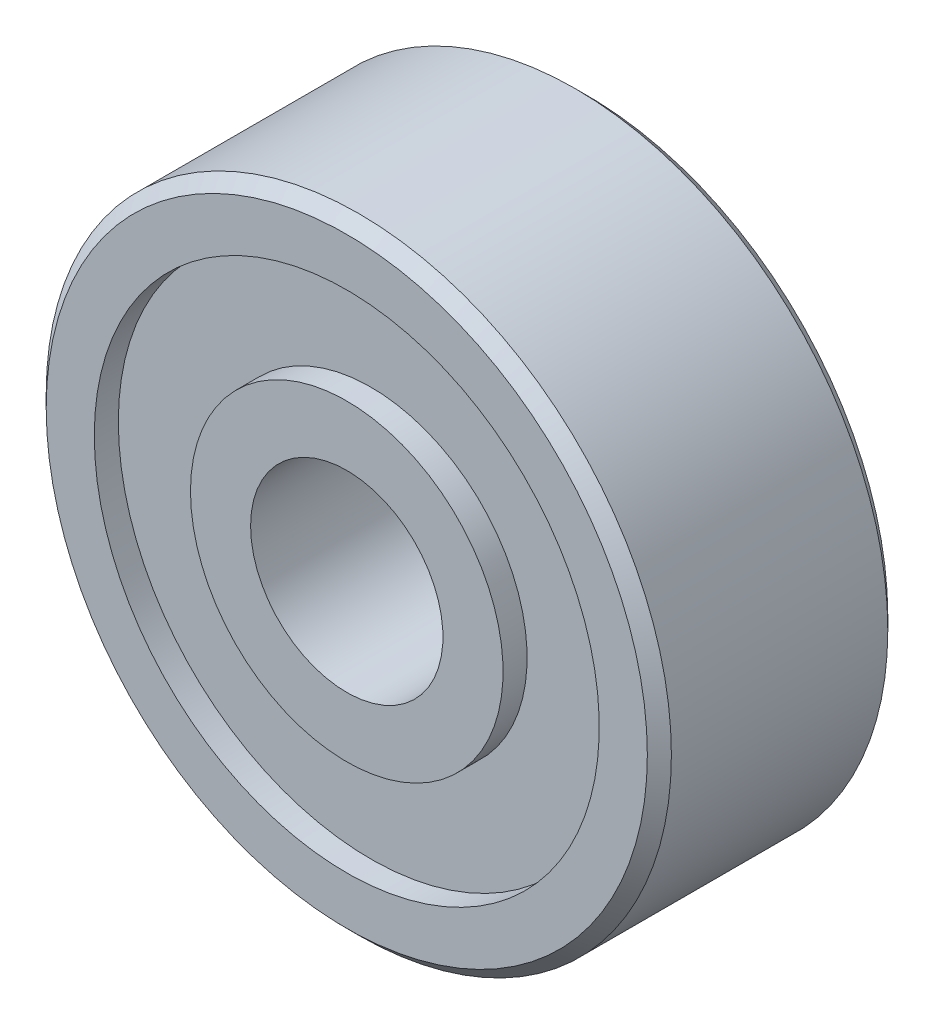
ISO-10303-21;
HEADER;
FILE_DESCRIPTION(('STEP AP214'),'2;1');
FILE_NAME('part.step','',(''),(''),'','','');
FILE_SCHEMA(('AUTOMOTIVE_DESIGN { 1 0 10303 214 1 1 1 1 }'));
ENDSEC;
DATA;
#1=APPLICATION_CONTEXT('core data for automotive mechanical design processes');
#2=APPLICATION_PROTOCOL_DEFINITION('international standard','automotive_design',2000,#1);
#3=PRODUCT_CONTEXT('',#1,'mechanical');
#4=PRODUCT('Part','Part','',(#3));
#5=PRODUCT_RELATED_PRODUCT_CATEGORY('part','',(#4));
#6=PRODUCT_DEFINITION_FORMATION('','',#4);
#7=PRODUCT_DEFINITION_CONTEXT('part definition',#1,'design');
#8=PRODUCT_DEFINITION('design','',#6,#7);
#9=PRODUCT_DEFINITION_SHAPE('','',#8);
#10=(LENGTH_UNIT() NAMED_UNIT(*) SI_UNIT(.MILLI.,.METRE.));
#11=(NAMED_UNIT(*) PLANE_ANGLE_UNIT() SI_UNIT($,.RADIAN.));
#12=(NAMED_UNIT(*) SI_UNIT($,.STERADIAN.) SOLID_ANGLE_UNIT());
#13=UNCERTAINTY_MEASURE_WITH_UNIT(LENGTH_MEASURE(1.E-05),#10,'distance_accuracy_value','');
#14=(GEOMETRIC_REPRESENTATION_CONTEXT(3) GLOBAL_UNCERTAINTY_ASSIGNED_CONTEXT((#13)) GLOBAL_UNIT_ASSIGNED_CONTEXT((#10,
#11,#12)) REPRESENTATION_CONTEXT('',''));
#15=CARTESIAN_POINT('',(0.,0.,0.));
#16=DIRECTION('',(0.,0.,1.));
#17=DIRECTION('',(1.,0.,0.));
#18=AXIS2_PLACEMENT_3D('',#15,#16,#17);
#19=CARTESIAN_POINT('',(0.,0.,2.5));
#20=DIRECTION('',(0.,0.,-1.));
#21=DIRECTION('',(-1.,0.,0.));
#22=AXIS2_PLACEMENT_3D('',#19,#20,#21);
#23=CYLINDRICAL_SURFACE('',#22,6.5);
#24=CARTESIAN_POINT('',(0.,0.,2.25));
#25=DIRECTION('',(0.,0.,-1.));
#26=DIRECTION('',(-1.,0.,0.));
#27=AXIS2_PLACEMENT_3D('',#24,#25,#26);
#28=CIRCLE('',#27,6.5);
#29=CARTESIAN_POINT('',(-6.5,0.,2.25));
#30=VERTEX_POINT('',#29);
#31=EDGE_CURVE('E10',#30,#30,#28,.T.);
#32=ORIENTED_EDGE('',*,*,#31,.T.);
#33=EDGE_LOOP('',(#32));
#34=FACE_BOUND('',#33,.T.);
#35=CARTESIAN_POINT('',(0.,0.,-2.25));
#36=DIRECTION('',(0.,0.,-1.));
#37=DIRECTION('',(-1.,0.,0.));
#38=AXIS2_PLACEMENT_3D('',#35,#36,#37);
#39=CIRCLE('',#38,6.5);
#40=CARTESIAN_POINT('',(-6.49999999999999,0.,-2.25));
#41=VERTEX_POINT('',#40);
#42=EDGE_CURVE('E76',#41,#41,#39,.T.);
#43=ORIENTED_EDGE('',*,*,#42,.F.);
#44=EDGE_LOOP('',(#43));
#45=FACE_BOUND('',#44,.T.);
#46=ADVANCED_FACE('F30',(#34,#45),#23,.T.);
#47=CARTESIAN_POINT('',(0.,0.,2.25));
#48=DIRECTION('',(0.,0.,-1.));
#49=DIRECTION('',(-1.,0.,0.));
#50=AXIS2_PLACEMENT_3D('',#47,#48,#49);
#51=CONICAL_SURFACE('',#50,6.5,0.785398163397456);
#52=CARTESIAN_POINT('',(0.,0.,2.5));
#53=DIRECTION('',(0.,0.,-1.));
#54=DIRECTION('',(-1.,0.,0.));
#55=AXIS2_PLACEMENT_3D('',#52,#53,#54);
#56=CIRCLE('',#55,6.25);
#57=CARTESIAN_POINT('',(-6.24999999999999,0.,2.5));
#58=VERTEX_POINT('',#57);
#59=EDGE_CURVE('E36',#58,#58,#56,.T.);
#60=ORIENTED_EDGE('',*,*,#59,.T.);
#61=EDGE_LOOP('',(#60));
#62=FACE_BOUND('',#61,.T.);
#63=ORIENTED_EDGE('',*,*,#31,.F.);
#64=EDGE_LOOP('',(#63));
#65=FACE_BOUND('',#64,.T.);
#66=ADVANCED_FACE('F84',(#62,#65),#51,.T.);
#67=CARTESIAN_POINT('',(6.25,0.,2.5));
#68=DIRECTION('',(0.,0.,1.));
#69=DIRECTION('',(1.,0.,0.));
#70=AXIS2_PLACEMENT_3D('',#67,#68,#69);
#71=PLANE('',#70);
#72=CARTESIAN_POINT('',(0.,0.,2.5));
#73=DIRECTION('',(0.,0.,-1.));
#74=DIRECTION('',(-1.,0.,0.));
#75=AXIS2_PLACEMENT_3D('',#72,#73,#74);
#76=CIRCLE('',#75,5.25);
#77=CARTESIAN_POINT('',(-5.24999999999999,0.,2.5));
#78=VERTEX_POINT('',#77);
#79=EDGE_CURVE('E40',#78,#78,#76,.T.);
#80=ORIENTED_EDGE('',*,*,#79,.T.);
#81=EDGE_LOOP('',(#80));
#82=FACE_BOUND('',#81,.T.);
#83=ORIENTED_EDGE('',*,*,#59,.F.);
#84=EDGE_LOOP('',(#83));
#85=FACE_BOUND('',#84,.T.);
#86=ADVANCED_FACE('F88',(#82,#85),#71,.T.);
#87=CARTESIAN_POINT('',(0.,0.,2.5));
#88=DIRECTION('',(0.,0.,-1.));
#89=DIRECTION('',(-1.,0.,0.));
#90=AXIS2_PLACEMENT_3D('',#87,#88,#89);
#91=CYLINDRICAL_SURFACE('',#90,5.25);
#92=CARTESIAN_POINT('',(0.,0.,2.));
#93=DIRECTION('',(0.,0.,-1.));
#94=DIRECTION('',(-1.,0.,0.));
#95=AXIS2_PLACEMENT_3D('',#92,#93,#94);
#96=CIRCLE('',#95,5.25);
#97=CARTESIAN_POINT('',(-5.24999999999999,0.,2.));
#98=VERTEX_POINT('',#97);
#99=EDGE_CURVE('E44',#98,#98,#96,.T.);
#100=ORIENTED_EDGE('',*,*,#99,.T.);
#101=EDGE_LOOP('',(#100));
#102=FACE_BOUND('',#101,.T.);
#103=ORIENTED_EDGE('',*,*,#79,.F.);
#104=EDGE_LOOP('',(#103));
#105=FACE_BOUND('',#104,.T.);
#106=ADVANCED_FACE('F92',(#102,#105),#91,.F.);
#107=CARTESIAN_POINT('',(5.25,0.,2.));
#108=DIRECTION('',(0.,0.,1.));
#109=DIRECTION('',(1.,0.,0.));
#110=AXIS2_PLACEMENT_3D('',#107,#108,#109);
#111=PLANE('',#110);
#112=CARTESIAN_POINT('',(0.,0.,2.));
#113=DIRECTION('',(0.,0.,-1.));
#114=DIRECTION('',(-1.,0.,0.));
#115=AXIS2_PLACEMENT_3D('',#112,#113,#114);
#116=CIRCLE('',#115,3.25);
#117=CARTESIAN_POINT('',(-3.24999999999999,0.,2.));
#118=VERTEX_POINT('',#117);
#119=EDGE_CURVE('E49',#118,#118,#116,.T.);
#120=ORIENTED_EDGE('',*,*,#119,.T.);
#121=EDGE_LOOP('',(#120));
#122=FACE_BOUND('',#121,.T.);
#123=ORIENTED_EDGE('',*,*,#99,.F.);
#124=EDGE_LOOP('',(#123));
#125=FACE_BOUND('',#124,.T.);
#126=ADVANCED_FACE('F99',(#122,#125),#111,.T.);
#127=CARTESIAN_POINT('',(0.,0.,2.5));
#128=DIRECTION('',(0.,0.,-1.));
#129=DIRECTION('',(-1.,0.,0.));
#130=AXIS2_PLACEMENT_3D('',#127,#128,#129);
#131=CYLINDRICAL_SURFACE('',#130,3.25);
#132=CARTESIAN_POINT('',(0.,0.,2.5));
#133=DIRECTION('',(0.,0.,-1.));
#134=DIRECTION('',(-1.,0.,0.));
#135=AXIS2_PLACEMENT_3D('',#132,#133,#134);
#136=CIRCLE('',#135,3.25);
#137=CARTESIAN_POINT('',(-3.24999999999999,0.,2.5));
#138=VERTEX_POINT('',#137);
#139=EDGE_CURVE('E52',#138,#138,#136,.T.);
#140=ORIENTED_EDGE('',*,*,#139,.T.);
#141=EDGE_LOOP('',(#140));
#142=FACE_BOUND('',#141,.T.);
#143=ORIENTED_EDGE('',*,*,#119,.F.);
#144=EDGE_LOOP('',(#143));
#145=FACE_BOUND('',#144,.T.);
#146=ADVANCED_FACE('F103',(#142,#145),#131,.T.);
#147=CARTESIAN_POINT('',(3.25,0.,2.5));
#148=DIRECTION('',(0.,0.,1.));
#149=DIRECTION('',(1.,0.,0.));
#150=AXIS2_PLACEMENT_3D('',#147,#148,#149);
#151=PLANE('',#150);
#152=CARTESIAN_POINT('',(0.,0.,2.5));
#153=DIRECTION('',(0.,0.,-1.));
#154=DIRECTION('',(-1.,0.,0.));
#155=AXIS2_PLACEMENT_3D('',#152,#153,#154);
#156=CIRCLE('',#155,2.);
#157=CARTESIAN_POINT('',(-2.,0.,2.5));
#158=VERTEX_POINT('',#157);
#159=EDGE_CURVE('E55',#158,#158,#156,.T.);
#160=ORIENTED_EDGE('',*,*,#159,.T.);
#161=EDGE_LOOP('',(#160));
#162=FACE_BOUND('',#161,.T.);
#163=ORIENTED_EDGE('',*,*,#139,.F.);
#164=EDGE_LOOP('',(#163));
#165=FACE_BOUND('',#164,.T.);
#166=ADVANCED_FACE('F107',(#162,#165),#151,.T.);
#167=CARTESIAN_POINT('',(0.,0.,2.5));
#168=DIRECTION('',(0.,0.,-1.));
#169=DIRECTION('',(-1.,0.,0.));
#170=AXIS2_PLACEMENT_3D('',#167,#168,#169);
#171=CYLINDRICAL_SURFACE('',#170,2.);
#172=CARTESIAN_POINT('',(0.,0.,-2.5));
#173=DIRECTION('',(0.,0.,-1.));
#174=DIRECTION('',(-1.,0.,0.));
#175=AXIS2_PLACEMENT_3D('',#172,#173,#174);
#176=CIRCLE('',#175,2.);
#177=CARTESIAN_POINT('',(-2.,0.,-2.5));
#178=VERTEX_POINT('',#177);
#179=EDGE_CURVE('E58',#178,#178,#176,.T.);
#180=ORIENTED_EDGE('',*,*,#179,.T.);
#181=EDGE_LOOP('',(#180));
#182=FACE_BOUND('',#181,.T.);
#183=ORIENTED_EDGE('',*,*,#159,.F.);
#184=EDGE_LOOP('',(#183));
#185=FACE_BOUND('',#184,.T.);
#186=ADVANCED_FACE('F111',(#182,#185),#171,.F.);
#187=CARTESIAN_POINT('',(2.,0.,-2.5));
#188=DIRECTION('',(0.,0.,-1.));
#189=DIRECTION('',(-1.,0.,0.));
#190=AXIS2_PLACEMENT_3D('',#187,#188,#189);
#191=PLANE('',#190);
#192=CARTESIAN_POINT('',(0.,0.,-2.5));
#193=DIRECTION('',(0.,0.,-1.));
#194=DIRECTION('',(-1.,0.,0.));
#195=AXIS2_PLACEMENT_3D('',#192,#193,#194);
#196=CIRCLE('',#195,3.25);
#197=CARTESIAN_POINT('',(-3.24999999999999,0.,-2.5));
#198=VERTEX_POINT('',#197);
#199=EDGE_CURVE('E61',#198,#198,#196,.T.);
#200=ORIENTED_EDGE('',*,*,#199,.T.);
#201=EDGE_LOOP('',(#200));
#202=FACE_BOUND('',#201,.T.);
#203=ORIENTED_EDGE('',*,*,#179,.F.);
#204=EDGE_LOOP('',(#203));
#205=FACE_BOUND('',#204,.T.);
#206=ADVANCED_FACE('F115',(#202,#205),#191,.T.);
#207=CARTESIAN_POINT('',(0.,0.,2.5));
#208=DIRECTION('',(0.,0.,-1.));
#209=DIRECTION('',(-1.,0.,0.));
#210=AXIS2_PLACEMENT_3D('',#207,#208,#209);
#211=CYLINDRICAL_SURFACE('',#210,3.25);
#212=CARTESIAN_POINT('',(0.,0.,-2.));
#213=DIRECTION('',(0.,0.,-1.));
#214=DIRECTION('',(-1.,0.,0.));
#215=AXIS2_PLACEMENT_3D('',#212,#213,#214);
#216=CIRCLE('',#215,3.25);
#217=CARTESIAN_POINT('',(-3.24999999999999,0.,-2.));
#218=VERTEX_POINT('',#217);
#219=EDGE_CURVE('E64',#218,#218,#216,.T.);
#220=ORIENTED_EDGE('',*,*,#219,.T.);
#221=EDGE_LOOP('',(#220));
#222=FACE_BOUND('',#221,.T.);
#223=ORIENTED_EDGE('',*,*,#199,.F.);
#224=EDGE_LOOP('',(#223));
#225=FACE_BOUND('',#224,.T.);
#226=ADVANCED_FACE('F119',(#222,#225),#211,.T.);
#227=CARTESIAN_POINT('',(3.25,0.,-2.));
#228=DIRECTION('',(0.,0.,-1.));
#229=DIRECTION('',(-1.,0.,0.));
#230=AXIS2_PLACEMENT_3D('',#227,#228,#229);
#231=PLANE('',#230);
#232=CARTESIAN_POINT('',(0.,0.,-2.));
#233=DIRECTION('',(0.,0.,-1.));
#234=DIRECTION('',(-1.,0.,0.));
#235=AXIS2_PLACEMENT_3D('',#232,#233,#234);
#236=CIRCLE('',#235,5.25);
#237=CARTESIAN_POINT('',(-5.24999999999999,0.,-2.));
#238=VERTEX_POINT('',#237);
#239=EDGE_CURVE('E67',#238,#238,#236,.T.);
#240=ORIENTED_EDGE('',*,*,#239,.T.);
#241=EDGE_LOOP('',(#240));
#242=FACE_BOUND('',#241,.T.);
#243=ORIENTED_EDGE('',*,*,#219,.F.);
#244=EDGE_LOOP('',(#243));
#245=FACE_BOUND('',#244,.T.);
#246=ADVANCED_FACE('F123',(#242,#245),#231,.T.);
#247=CARTESIAN_POINT('',(0.,0.,2.5));
#248=DIRECTION('',(0.,0.,-1.));
#249=DIRECTION('',(-1.,0.,0.));
#250=AXIS2_PLACEMENT_3D('',#247,#248,#249);
#251=CYLINDRICAL_SURFACE('',#250,5.25);
#252=CARTESIAN_POINT('',(0.,0.,-2.5));
#253=DIRECTION('',(0.,0.,-1.));
#254=DIRECTION('',(-1.,0.,0.));
#255=AXIS2_PLACEMENT_3D('',#252,#253,#254);
#256=CIRCLE('',#255,5.25);
#257=CARTESIAN_POINT('',(-5.24999999999999,0.,-2.5));
#258=VERTEX_POINT('',#257);
#259=EDGE_CURVE('E70',#258,#258,#256,.T.);
#260=ORIENTED_EDGE('',*,*,#259,.T.);
#261=EDGE_LOOP('',(#260));
#262=FACE_BOUND('',#261,.T.);
#263=ORIENTED_EDGE('',*,*,#239,.F.);
#264=EDGE_LOOP('',(#263));
#265=FACE_BOUND('',#264,.T.);
#266=ADVANCED_FACE('F127',(#262,#265),#251,.F.);
#267=CARTESIAN_POINT('',(5.25,0.,-2.5));
#268=DIRECTION('',(0.,0.,-1.));
#269=DIRECTION('',(-1.,0.,0.));
#270=AXIS2_PLACEMENT_3D('',#267,#268,#269);
#271=PLANE('',#270);
#272=CARTESIAN_POINT('',(0.,0.,-2.5));
#273=DIRECTION('',(0.,0.,-1.));
#274=DIRECTION('',(-1.,0.,0.));
#275=AXIS2_PLACEMENT_3D('',#272,#273,#274);
#276=CIRCLE('',#275,6.25);
#277=CARTESIAN_POINT('',(-6.24999999999999,0.,-2.5));
#278=VERTEX_POINT('',#277);
#279=EDGE_CURVE('E73',#278,#278,#276,.T.);
#280=ORIENTED_EDGE('',*,*,#279,.T.);
#281=EDGE_LOOP('',(#280));
#282=FACE_BOUND('',#281,.T.);
#283=ORIENTED_EDGE('',*,*,#259,.F.);
#284=EDGE_LOOP('',(#283));
#285=FACE_BOUND('',#284,.T.);
#286=ADVANCED_FACE('F131',(#282,#285),#271,.T.);
#287=CARTESIAN_POINT('',(0.,0.,-2.5));
#288=DIRECTION('',(0.,0.,1.));
#289=DIRECTION('',(1.,0.,0.));
#290=AXIS2_PLACEMENT_3D('',#287,#288,#289);
#291=CONICAL_SURFACE('',#290,6.25,0.785398163397452);
#292=ORIENTED_EDGE('',*,*,#42,.T.);
#293=EDGE_LOOP('',(#292));
#294=FACE_BOUND('',#293,.T.);
#295=ORIENTED_EDGE('',*,*,#279,.F.);
#296=EDGE_LOOP('',(#295));
#297=FACE_BOUND('',#296,.T.);
#298=ADVANCED_FACE('F80',(#294,#297),#291,.T.);
#299=CLOSED_SHELL('',(#46,#66,#86,#106,#126,#146,#166,#186,#206,#226,#246,#266,#286,#298));
#300=MANIFOLD_SOLID_BREP('B2',#299);
#301=ADVANCED_BREP_SHAPE_REPRESENTATION('',(#18,#300),#14);
#302=SHAPE_DEFINITION_REPRESENTATION(#9,#301);
ENDSEC;
END-ISO-10303-21;
